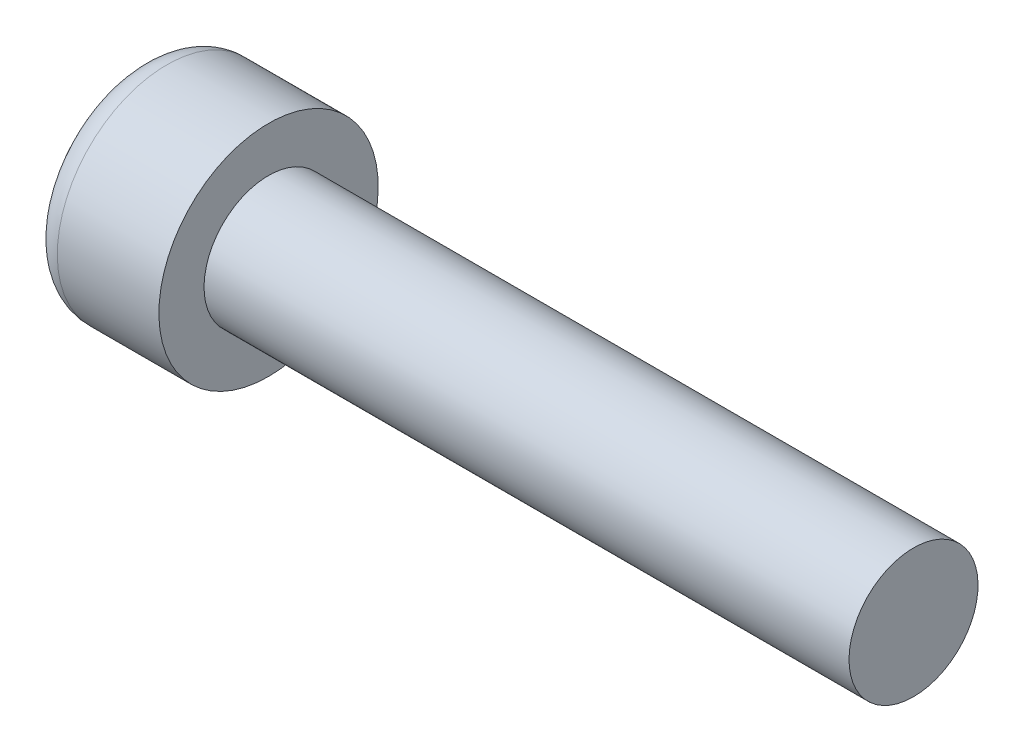
ISO-10303-21;
HEADER;
FILE_DESCRIPTION(('STEP AP214'),'2;1');
FILE_NAME('part.step','',(''),(''),'','','');
FILE_SCHEMA(('AUTOMOTIVE_DESIGN { 1 0 10303 214 1 1 1 1 }'));
ENDSEC;
DATA;
#1=APPLICATION_CONTEXT('core data for automotive mechanical design processes');
#2=APPLICATION_PROTOCOL_DEFINITION('international standard','automotive_design',2000,#1);
#3=PRODUCT_CONTEXT('',#1,'mechanical');
#4=PRODUCT('Part','Part','',(#3));
#5=PRODUCT_RELATED_PRODUCT_CATEGORY('part','',(#4));
#6=PRODUCT_DEFINITION_FORMATION('','',#4);
#7=PRODUCT_DEFINITION_CONTEXT('part definition',#1,'design');
#8=PRODUCT_DEFINITION('design','',#6,#7);
#9=PRODUCT_DEFINITION_SHAPE('','',#8);
#10=(LENGTH_UNIT() NAMED_UNIT(*) SI_UNIT(.MILLI.,.METRE.));
#11=(NAMED_UNIT(*) PLANE_ANGLE_UNIT() SI_UNIT($,.RADIAN.));
#12=(NAMED_UNIT(*) SI_UNIT($,.STERADIAN.) SOLID_ANGLE_UNIT());
#13=UNCERTAINTY_MEASURE_WITH_UNIT(LENGTH_MEASURE(1.E-05),#10,'distance_accuracy_value','');
#14=(GEOMETRIC_REPRESENTATION_CONTEXT(3) GLOBAL_UNCERTAINTY_ASSIGNED_CONTEXT((#13)) GLOBAL_UNIT_ASSIGNED_CONTEXT((#10,
#11,#12)) REPRESENTATION_CONTEXT('',''));
#15=CARTESIAN_POINT('',(0.,0.,0.));
#16=DIRECTION('',(0.,0.,1.));
#17=DIRECTION('',(1.,0.,0.));
#18=AXIS2_PLACEMENT_3D('',#15,#16,#17);
#19=CARTESIAN_POINT('',(0.,0.,0.));
#20=DIRECTION('',(1.,0.,0.));
#21=DIRECTION('',(0.,1.,0.));
#22=AXIS2_PLACEMENT_3D('',#19,#20,#21);
#23=PLANE('',#22);
#24=DIRECTION('',(0.,-0.5,-0.866025403784439));
#25=VECTOR('',#24,1.);
#26=CARTESIAN_POINT('',(0.,2.3094010767585,0.));
#27=LINE('',#26,#25);
#28=CARTESIAN_POINT('',(0.,2.3094010767585,0.));
#29=VERTEX_POINT('',#28);
#30=CARTESIAN_POINT('',(0.,1.15470053837925,-2.));
#31=VERTEX_POINT('',#30);
#32=EDGE_CURVE('E121',#29,#31,#27,.T.);
#33=ORIENTED_EDGE('',*,*,#32,.F.);
#34=DIRECTION('',(0.,0.5,-0.866025403784439));
#35=VECTOR('',#34,1.);
#36=CARTESIAN_POINT('',(0.,1.15470053837925,2.));
#37=LINE('',#36,#35);
#38=CARTESIAN_POINT('',(0.,1.15470053837925,2.));
#39=VERTEX_POINT('',#38);
#40=EDGE_CURVE('E47',#39,#29,#37,.T.);
#41=ORIENTED_EDGE('',*,*,#40,.F.);
#42=DIRECTION('',(0.,1.,0.));
#43=VECTOR('',#42,1.);
#44=CARTESIAN_POINT('',(0.,-1.15470053837925,2.));
#45=LINE('',#44,#43);
#46=CARTESIAN_POINT('',(0.,-1.15470053837925,2.));
#47=VERTEX_POINT('',#46);
#48=EDGE_CURVE('E130',#47,#39,#45,.T.);
#49=ORIENTED_EDGE('',*,*,#48,.F.);
#50=DIRECTION('',(0.,0.5,0.866025403784439));
#51=VECTOR('',#50,1.);
#52=CARTESIAN_POINT('',(0.,-2.3094010767585,0.));
#53=LINE('',#52,#51);
#54=CARTESIAN_POINT('',(0.,-2.3094010767585,0.));
#55=VERTEX_POINT('',#54);
#56=EDGE_CURVE('E128',#55,#47,#53,.T.);
#57=ORIENTED_EDGE('',*,*,#56,.F.);
#58=DIRECTION('',(0.,-0.5,0.866025403784439));
#59=VECTOR('',#58,1.);
#60=CARTESIAN_POINT('',(0.,-1.15470053837925,-2.));
#61=LINE('',#60,#59);
#62=CARTESIAN_POINT('',(0.,-1.15470053837925,-2.));
#63=VERTEX_POINT('',#62);
#64=EDGE_CURVE('E95',#63,#55,#61,.T.);
#65=ORIENTED_EDGE('',*,*,#64,.F.);
#66=DIRECTION('',(0.,-1.,0.));
#67=VECTOR('',#66,1.);
#68=CARTESIAN_POINT('',(0.,1.15470053837925,-2.));
#69=LINE('',#68,#67);
#70=EDGE_CURVE('E124',#31,#63,#69,.T.);
#71=ORIENTED_EDGE('',*,*,#70,.F.);
#72=EDGE_LOOP('',(#33,#41,#49,#57,#65,#71));
#73=FACE_BOUND('',#72,.T.);
#74=CARTESIAN_POINT('',(0.,0.,0.));
#75=DIRECTION('',(-1.,0.,0.));
#76=DIRECTION('',(0.,-1.,0.));
#77=AXIS2_PLACEMENT_3D('',#74,#75,#76);
#78=CIRCLE('',#77,3.1875);
#79=CARTESIAN_POINT('',(0.,-3.1875,0.));
#80=VERTEX_POINT('',#79);
#81=EDGE_CURVE('E11',#80,#80,#78,.T.);
#82=ORIENTED_EDGE('',*,*,#81,.T.);
#83=EDGE_LOOP('',(#82));
#84=FACE_BOUND('',#83,.T.);
#85=ADVANCED_FACE('F33',(#73,#84),#23,.F.);
#86=CARTESIAN_POINT('',(1.0625,0.,0.));
#87=DIRECTION('',(-1.,0.,0.));
#88=DIRECTION('',(0.,-1.,0.));
#89=AXIS2_PLACEMENT_3D('',#86,#87,#88);
#90=TOROIDAL_SURFACE('',#89,3.1875,1.0625);
#91=ORIENTED_EDGE('',*,*,#81,.F.);
#92=EDGE_LOOP('',(#91));
#93=FACE_BOUND('',#92,.T.);
#94=CARTESIAN_POINT('',(1.0625,0.,0.));
#95=DIRECTION('',(-1.,0.,0.));
#96=DIRECTION('',(0.,-1.,0.));
#97=AXIS2_PLACEMENT_3D('',#94,#95,#96);
#98=CIRCLE('',#97,4.25);
#99=CARTESIAN_POINT('',(1.0625,-4.25,0.));
#100=VERTEX_POINT('',#99);
#101=EDGE_CURVE('E40',#100,#100,#98,.T.);
#102=ORIENTED_EDGE('',*,*,#101,.T.);
#103=EDGE_LOOP('',(#102));
#104=FACE_BOUND('',#103,.T.);
#105=ADVANCED_FACE('F150',(#93,#104),#90,.T.);
#106=CARTESIAN_POINT('',(0.,0.,0.));
#107=DIRECTION('',(-1.,0.,0.));
#108=DIRECTION('',(0.,-1.,0.));
#109=AXIS2_PLACEMENT_3D('',#106,#107,#108);
#110=CYLINDRICAL_SURFACE('',#109,4.25);
#111=ORIENTED_EDGE('',*,*,#101,.F.);
#112=EDGE_LOOP('',(#111));
#113=FACE_BOUND('',#112,.T.);
#114=CARTESIAN_POINT('',(5.,0.,0.));
#115=DIRECTION('',(-1.,0.,0.));
#116=DIRECTION('',(0.,-1.,0.));
#117=AXIS2_PLACEMENT_3D('',#114,#115,#116);
#118=CIRCLE('',#117,4.25);
#119=CARTESIAN_POINT('',(5.,-4.25,0.));
#120=VERTEX_POINT('',#119);
#121=EDGE_CURVE('E145',#120,#120,#118,.T.);
#122=ORIENTED_EDGE('',*,*,#121,.T.);
#123=EDGE_LOOP('',(#122));
#124=FACE_BOUND('',#123,.T.);
#125=ADVANCED_FACE('F152',(#113,#124),#110,.T.);
#126=CARTESIAN_POINT('',(5.,4.25,0.));
#127=DIRECTION('',(-1.,0.,0.));
#128=DIRECTION('',(0.,-1.,0.));
#129=AXIS2_PLACEMENT_3D('',#126,#127,#128);
#130=PLANE('',#129);
#131=ORIENTED_EDGE('',*,*,#121,.F.);
#132=EDGE_LOOP('',(#131));
#133=FACE_BOUND('',#132,.T.);
#134=CARTESIAN_POINT('',(5.,0.,0.));
#135=DIRECTION('',(-1.,0.,0.));
#136=DIRECTION('',(0.,-1.,0.));
#137=AXIS2_PLACEMENT_3D('',#134,#135,#136);
#138=CIRCLE('',#137,2.5);
#139=CARTESIAN_POINT('',(5.,-2.5,0.));
#140=VERTEX_POINT('',#139);
#141=EDGE_CURVE('E142',#140,#140,#138,.T.);
#142=ORIENTED_EDGE('',*,*,#141,.T.);
#143=EDGE_LOOP('',(#142));
#144=FACE_BOUND('',#143,.T.);
#145=ADVANCED_FACE('F155',(#133,#144),#130,.F.);
#146=CARTESIAN_POINT('',(0.,0.,0.));
#147=DIRECTION('',(-1.,0.,0.));
#148=DIRECTION('',(0.,-1.,0.));
#149=AXIS2_PLACEMENT_3D('',#146,#147,#148);
#150=CYLINDRICAL_SURFACE('',#149,2.5);
#151=ORIENTED_EDGE('',*,*,#141,.F.);
#152=EDGE_LOOP('',(#151));
#153=FACE_BOUND('',#152,.T.);
#154=CARTESIAN_POINT('',(30.,0.,0.));
#155=DIRECTION('',(-1.,0.,0.));
#156=DIRECTION('',(0.,-1.,0.));
#157=AXIS2_PLACEMENT_3D('',#154,#155,#156);
#158=CIRCLE('',#157,2.49999999999999);
#159=CARTESIAN_POINT('',(30.,-2.49999999999999,0.));
#160=VERTEX_POINT('',#159);
#161=EDGE_CURVE('E134',#160,#160,#158,.T.);
#162=ORIENTED_EDGE('',*,*,#161,.T.);
#163=EDGE_LOOP('',(#162));
#164=FACE_BOUND('',#163,.T.);
#165=ADVANCED_FACE('F161',(#153,#164),#150,.T.);
#166=CARTESIAN_POINT('',(30.,2.5,0.));
#167=DIRECTION('',(-1.,0.,0.));
#168=DIRECTION('',(0.,-1.,0.));
#169=AXIS2_PLACEMENT_3D('',#166,#167,#168);
#170=PLANE('',#169);
#171=ORIENTED_EDGE('',*,*,#161,.F.);
#172=EDGE_LOOP('',(#171));
#173=FACE_BOUND('',#172,.T.);
#174=ADVANCED_FACE('F167',(#173),#170,.F.);
#175=CARTESIAN_POINT('',(2.5,1.15470053837925,2.));
#176=DIRECTION('',(0.,0.866025403784439,0.5));
#177=DIRECTION('',(0.,-0.5,0.866025403784439));
#178=AXIS2_PLACEMENT_3D('',#175,#176,#177);
#179=PLANE('',#178);
#180=ORIENTED_EDGE('',*,*,#40,.T.);
#181=DIRECTION('',(-1.,0.,0.));
#182=VECTOR('',#181,1.);
#183=CARTESIAN_POINT('',(2.5,2.3094010767585,0.));
#184=LINE('',#183,#182);
#185=CARTESIAN_POINT('',(2.5,2.3094010767585,0.));
#186=VERTEX_POINT('',#185);
#187=EDGE_CURVE('E77',#186,#29,#184,.T.);
#188=ORIENTED_EDGE('',*,*,#187,.F.);
#189=DIRECTION('',(0.,0.5,-0.866025403784439));
#190=VECTOR('',#189,1.);
#191=CARTESIAN_POINT('',(2.5,1.15470053837925,2.));
#192=LINE('',#191,#190);
#193=CARTESIAN_POINT('',(2.5,1.15470053837925,2.));
#194=VERTEX_POINT('',#193);
#195=EDGE_CURVE('E132',#194,#186,#192,.T.);
#196=ORIENTED_EDGE('',*,*,#195,.F.);
#197=DIRECTION('',(-1.,0.,0.));
#198=VECTOR('',#197,1.);
#199=CARTESIAN_POINT('',(2.5,1.15470053837925,2.));
#200=LINE('',#199,#198);
#201=EDGE_CURVE('E55',#194,#39,#200,.T.);
#202=ORIENTED_EDGE('',*,*,#201,.T.);
#203=EDGE_LOOP('',(#180,#188,#196,#202));
#204=FACE_BOUND('',#203,.T.);
#205=ADVANCED_FACE('F172',(#204),#179,.F.);
#206=CARTESIAN_POINT('',(2.5,-1.15470053837925,2.));
#207=DIRECTION('',(0.,0.,1.));
#208=DIRECTION('',(1.,0.,0.));
#209=AXIS2_PLACEMENT_3D('',#206,#207,#208);
#210=PLANE('',#209);
#211=ORIENTED_EDGE('',*,*,#48,.T.);
#212=ORIENTED_EDGE('',*,*,#201,.F.);
#213=DIRECTION('',(0.,1.,0.));
#214=VECTOR('',#213,1.);
#215=CARTESIAN_POINT('',(2.5,-1.15470053837925,2.));
#216=LINE('',#215,#214);
#217=CARTESIAN_POINT('',(2.5,-1.15470053837925,2.));
#218=VERTEX_POINT('',#217);
#219=EDGE_CURVE('E107',#218,#194,#216,.T.);
#220=ORIENTED_EDGE('',*,*,#219,.F.);
#221=DIRECTION('',(-1.,0.,0.));
#222=VECTOR('',#221,1.);
#223=CARTESIAN_POINT('',(2.5,-1.15470053837925,2.));
#224=LINE('',#223,#222);
#225=EDGE_CURVE('E99',#218,#47,#224,.T.);
#226=ORIENTED_EDGE('',*,*,#225,.T.);
#227=EDGE_LOOP('',(#211,#212,#220,#226));
#228=FACE_BOUND('',#227,.T.);
#229=ADVANCED_FACE('F177',(#228),#210,.F.);
#230=CARTESIAN_POINT('',(2.5,-2.3094010767585,0.));
#231=DIRECTION('',(0.,-0.866025403784439,0.5));
#232=DIRECTION('',(0.,-0.5,-0.866025403784439));
#233=AXIS2_PLACEMENT_3D('',#230,#231,#232);
#234=PLANE('',#233);
#235=ORIENTED_EDGE('',*,*,#56,.T.);
#236=ORIENTED_EDGE('',*,*,#225,.F.);
#237=DIRECTION('',(0.,0.5,0.866025403784439));
#238=VECTOR('',#237,1.);
#239=CARTESIAN_POINT('',(2.5,-2.3094010767585,0.));
#240=LINE('',#239,#238);
#241=CARTESIAN_POINT('',(2.5,-2.3094010767585,0.));
#242=VERTEX_POINT('',#241);
#243=EDGE_CURVE('E103',#242,#218,#240,.T.);
#244=ORIENTED_EDGE('',*,*,#243,.F.);
#245=DIRECTION('',(-1.,0.,0.));
#246=VECTOR('',#245,1.);
#247=CARTESIAN_POINT('',(2.5,-2.3094010767585,0.));
#248=LINE('',#247,#246);
#249=EDGE_CURVE('E88',#242,#55,#248,.T.);
#250=ORIENTED_EDGE('',*,*,#249,.T.);
#251=EDGE_LOOP('',(#235,#236,#244,#250));
#252=FACE_BOUND('',#251,.T.);
#253=ADVANCED_FACE('F104',(#252),#234,.F.);
#254=CARTESIAN_POINT('',(2.5,-1.15470053837925,-2.));
#255=DIRECTION('',(0.,-0.866025403784438,-0.5));
#256=DIRECTION('',(0.,0.5,-0.866025403784438));
#257=AXIS2_PLACEMENT_3D('',#254,#255,#256);
#258=PLANE('',#257);
#259=ORIENTED_EDGE('',*,*,#64,.T.);
#260=ORIENTED_EDGE('',*,*,#249,.F.);
#261=DIRECTION('',(0.,-0.5,0.866025403784439));
#262=VECTOR('',#261,1.);
#263=CARTESIAN_POINT('',(2.5,-1.15470053837925,-2.));
#264=LINE('',#263,#262);
#265=CARTESIAN_POINT('',(2.5,-1.15470053837925,-2.));
#266=VERTEX_POINT('',#265);
#267=EDGE_CURVE('E92',#266,#242,#264,.T.);
#268=ORIENTED_EDGE('',*,*,#267,.F.);
#269=DIRECTION('',(-1.,0.,0.));
#270=VECTOR('',#269,1.);
#271=CARTESIAN_POINT('',(2.5,-1.15470053837925,-2.));
#272=LINE('',#271,#270);
#273=EDGE_CURVE('E100',#266,#63,#272,.T.);
#274=ORIENTED_EDGE('',*,*,#273,.T.);
#275=EDGE_LOOP('',(#259,#260,#268,#274));
#276=FACE_BOUND('',#275,.T.);
#277=ADVANCED_FACE('F90',(#276),#258,.F.);
#278=CARTESIAN_POINT('',(2.5,1.15470053837925,-2.));
#279=DIRECTION('',(0.,0.,-1.));
#280=DIRECTION('',(-1.,0.,0.));
#281=AXIS2_PLACEMENT_3D('',#278,#279,#280);
#282=PLANE('',#281);
#283=ORIENTED_EDGE('',*,*,#70,.T.);
#284=ORIENTED_EDGE('',*,*,#273,.F.);
#285=DIRECTION('',(0.,-1.,0.));
#286=VECTOR('',#285,1.);
#287=CARTESIAN_POINT('',(2.5,1.15470053837925,-2.));
#288=LINE('',#287,#286);
#289=CARTESIAN_POINT('',(2.5,1.15470053837925,-2.));
#290=VERTEX_POINT('',#289);
#291=EDGE_CURVE('E113',#290,#266,#288,.T.);
#292=ORIENTED_EDGE('',*,*,#291,.F.);
#293=DIRECTION('',(-1.,0.,0.));
#294=VECTOR('',#293,1.);
#295=CARTESIAN_POINT('',(2.5,1.15470053837925,-2.));
#296=LINE('',#295,#294);
#297=EDGE_CURVE('E137',#290,#31,#296,.T.);
#298=ORIENTED_EDGE('',*,*,#297,.T.);
#299=EDGE_LOOP('',(#283,#284,#292,#298));
#300=FACE_BOUND('',#299,.T.);
#301=ADVANCED_FACE('F203',(#300),#282,.F.);
#302=CARTESIAN_POINT('',(2.5,2.3094010767585,0.));
#303=DIRECTION('',(0.,0.866025403784439,-0.5));
#304=DIRECTION('',(0.,0.5,0.866025403784439));
#305=AXIS2_PLACEMENT_3D('',#302,#303,#304);
#306=PLANE('',#305);
#307=ORIENTED_EDGE('',*,*,#32,.T.);
#308=ORIENTED_EDGE('',*,*,#297,.F.);
#309=DIRECTION('',(0.,-0.5,-0.866025403784439));
#310=VECTOR('',#309,1.);
#311=CARTESIAN_POINT('',(2.5,2.3094010767585,0.));
#312=LINE('',#311,#310);
#313=EDGE_CURVE('E115',#186,#290,#312,.T.);
#314=ORIENTED_EDGE('',*,*,#313,.F.);
#315=ORIENTED_EDGE('',*,*,#187,.T.);
#316=EDGE_LOOP('',(#307,#308,#314,#315));
#317=FACE_BOUND('',#316,.T.);
#318=ADVANCED_FACE('F191',(#317),#306,.F.);
#319=CARTESIAN_POINT('',(2.5,0.,0.));
#320=DIRECTION('',(-1.,0.,0.));
#321=DIRECTION('',(0.,-1.,0.));
#322=AXIS2_PLACEMENT_3D('',#319,#320,#321);
#323=PLANE('',#322);
#324=ORIENTED_EDGE('',*,*,#195,.T.);
#325=ORIENTED_EDGE('',*,*,#313,.T.);
#326=ORIENTED_EDGE('',*,*,#291,.T.);
#327=ORIENTED_EDGE('',*,*,#267,.T.);
#328=ORIENTED_EDGE('',*,*,#243,.T.);
#329=ORIENTED_EDGE('',*,*,#219,.T.);
#330=EDGE_LOOP('',(#324,#325,#326,#327,#328,#329));
#331=FACE_BOUND('',#330,.T.);
#332=ADVANCED_FACE('F110',(#331),#323,.T.);
#333=CLOSED_SHELL('',(#85,#105,#125,#145,#165,#174,#205,#229,#253,#277,#301,#318,#332));
#334=MANIFOLD_SOLID_BREP('B2',#333);
#335=ADVANCED_BREP_SHAPE_REPRESENTATION('',(#18,#334),#14);
#336=SHAPE_DEFINITION_REPRESENTATION(#9,#335);
ENDSEC;
END-ISO-10303-21;
